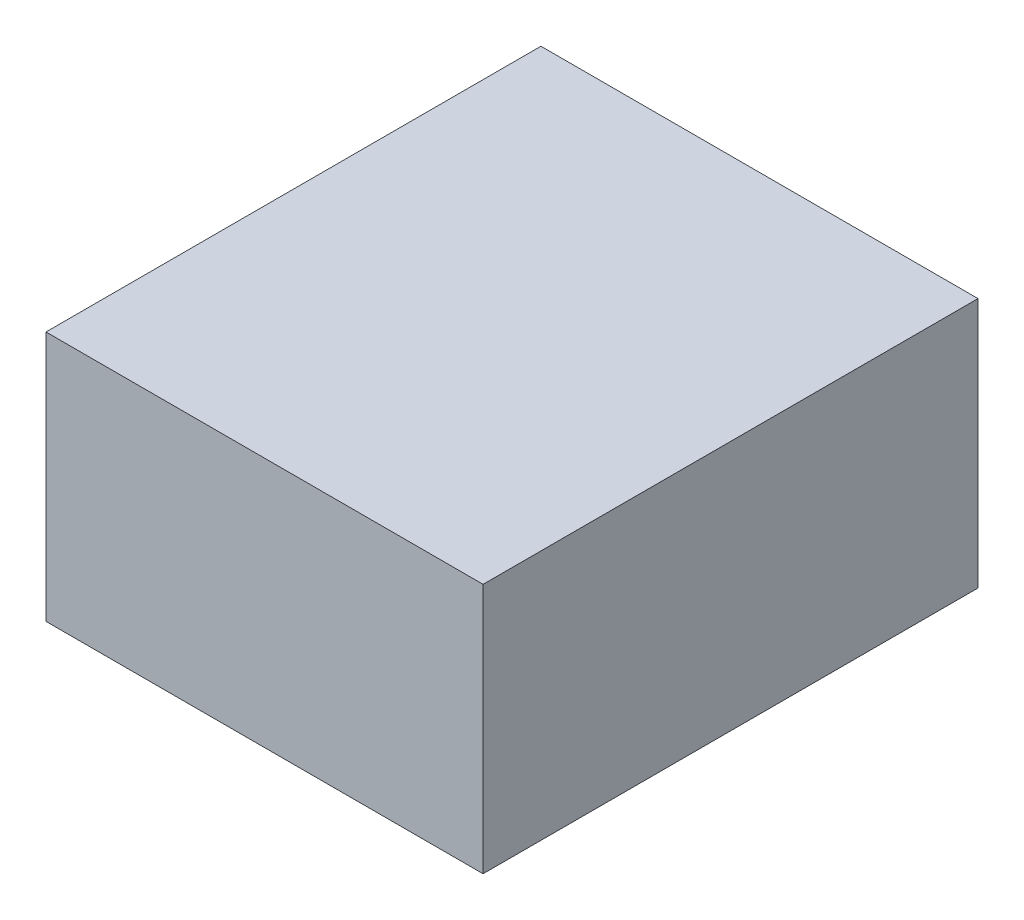
ISO-10303-21;
HEADER;
FILE_DESCRIPTION(('STEP AP214'),'2;1');
FILE_NAME('part.step','',(''),(''),'','','');
FILE_SCHEMA(('AUTOMOTIVE_DESIGN { 1 0 10303 214 1 1 1 1 }'));
ENDSEC;
DATA;
#1=APPLICATION_CONTEXT('core data for automotive mechanical design processes');
#2=APPLICATION_PROTOCOL_DEFINITION('international standard','automotive_design',2000,#1);
#3=PRODUCT_CONTEXT('',#1,'mechanical');
#4=PRODUCT('Part','Part','',(#3));
#5=PRODUCT_RELATED_PRODUCT_CATEGORY('part','',(#4));
#6=PRODUCT_DEFINITION_FORMATION('','',#4);
#7=PRODUCT_DEFINITION_CONTEXT('part definition',#1,'design');
#8=PRODUCT_DEFINITION('design','',#6,#7);
#9=PRODUCT_DEFINITION_SHAPE('','',#8);
#10=(LENGTH_UNIT() NAMED_UNIT(*) SI_UNIT(.MILLI.,.METRE.));
#11=(NAMED_UNIT(*) PLANE_ANGLE_UNIT() SI_UNIT($,.RADIAN.));
#12=(NAMED_UNIT(*) SI_UNIT($,.STERADIAN.) SOLID_ANGLE_UNIT());
#13=UNCERTAINTY_MEASURE_WITH_UNIT(LENGTH_MEASURE(1.E-05),#10,'distance_accuracy_value','');
#14=(GEOMETRIC_REPRESENTATION_CONTEXT(3) GLOBAL_UNCERTAINTY_ASSIGNED_CONTEXT((#13)) GLOBAL_UNIT_ASSIGNED_CONTEXT((#10,
#11,#12)) REPRESENTATION_CONTEXT('',''));
#15=CARTESIAN_POINT('',(0.,0.,0.));
#16=DIRECTION('',(0.,0.,1.));
#17=DIRECTION('',(1.,0.,0.));
#18=AXIS2_PLACEMENT_3D('',#15,#16,#17);
#19=CARTESIAN_POINT('',(34.,-19.5,38.5));
#20=DIRECTION('',(-1.,0.,0.));
#21=DIRECTION('',(0.,0.,1.));
#22=AXIS2_PLACEMENT_3D('',#19,#20,#21);
#23=PLANE('',#22);
#24=DIRECTION('',(0.,1.,0.));
#25=VECTOR('',#24,1.);
#26=CARTESIAN_POINT('',(34.,-19.5,-38.5));
#27=LINE('',#26,#25);
#28=CARTESIAN_POINT('',(34.,-19.5,-38.5));
#29=VERTEX_POINT('',#28);
#30=CARTESIAN_POINT('',(34.,19.5,-38.5));
#31=VERTEX_POINT('',#30);
#32=EDGE_CURVE('E111',#29,#31,#27,.T.);
#33=ORIENTED_EDGE('',*,*,#32,.T.);
#34=DIRECTION('',(0.,0.,-1.));
#35=VECTOR('',#34,1.);
#36=CARTESIAN_POINT('',(34.,19.5,38.5));
#37=LINE('',#36,#35);
#38=CARTESIAN_POINT('',(34.,19.5,38.5));
#39=VERTEX_POINT('',#38);
#40=EDGE_CURVE('E11',#39,#31,#37,.T.);
#41=ORIENTED_EDGE('',*,*,#40,.F.);
#42=DIRECTION('',(0.,1.,0.));
#43=VECTOR('',#42,1.);
#44=CARTESIAN_POINT('',(34.,-19.5,38.5));
#45=LINE('',#44,#43);
#46=CARTESIAN_POINT('',(34.,-19.5,38.5));
#47=VERTEX_POINT('',#46);
#48=EDGE_CURVE('E95',#47,#39,#45,.T.);
#49=ORIENTED_EDGE('',*,*,#48,.F.);
#50=DIRECTION('',(0.,0.,-1.));
#51=VECTOR('',#50,1.);
#52=CARTESIAN_POINT('',(34.,-19.5,38.5));
#53=LINE('',#52,#51);
#54=EDGE_CURVE('E107',#47,#29,#53,.T.);
#55=ORIENTED_EDGE('',*,*,#54,.T.);
#56=EDGE_LOOP('',(#33,#41,#49,#55));
#57=FACE_BOUND('',#56,.T.);
#58=ADVANCED_FACE('F43',(#57),#23,.F.);
#59=CARTESIAN_POINT('',(-34.,19.5,38.5));
#60=DIRECTION('',(0.,-1.,0.));
#61=DIRECTION('',(0.,0.,-1.));
#62=AXIS2_PLACEMENT_3D('',#59,#60,#61);
#63=PLANE('',#62);
#64=DIRECTION('',(-1.,0.,0.));
#65=VECTOR('',#64,1.);
#66=CARTESIAN_POINT('',(-34.,19.5,-38.5));
#67=LINE('',#66,#65);
#68=CARTESIAN_POINT('',(-34.,19.5,-38.5));
#69=VERTEX_POINT('',#68);
#70=EDGE_CURVE('E100',#31,#69,#67,.T.);
#71=ORIENTED_EDGE('',*,*,#70,.T.);
#72=DIRECTION('',(0.,0.,-1.));
#73=VECTOR('',#72,1.);
#74=CARTESIAN_POINT('',(-34.,19.5,38.5));
#75=LINE('',#74,#73);
#76=CARTESIAN_POINT('',(-34.,19.5,38.5));
#77=VERTEX_POINT('',#76);
#78=EDGE_CURVE('E52',#77,#69,#75,.T.);
#79=ORIENTED_EDGE('',*,*,#78,.F.);
#80=DIRECTION('',(-1.,0.,0.));
#81=VECTOR('',#80,1.);
#82=CARTESIAN_POINT('',(-34.,19.5,38.5));
#83=LINE('',#82,#81);
#84=EDGE_CURVE('E90',#39,#77,#83,.T.);
#85=ORIENTED_EDGE('',*,*,#84,.F.);
#86=ORIENTED_EDGE('',*,*,#40,.T.);
#87=EDGE_LOOP('',(#71,#79,#85,#86));
#88=FACE_BOUND('',#87,.T.);
#89=ADVANCED_FACE('F99',(#88),#63,.F.);
#90=CARTESIAN_POINT('',(-34.,-19.5,38.5));
#91=DIRECTION('',(1.,0.,0.));
#92=DIRECTION('',(0.,0.,-1.));
#93=AXIS2_PLACEMENT_3D('',#90,#91,#92);
#94=PLANE('',#93);
#95=DIRECTION('',(0.,-1.,0.));
#96=VECTOR('',#95,1.);
#97=CARTESIAN_POINT('',(-34.,-19.5,-38.5));
#98=LINE('',#97,#96);
#99=CARTESIAN_POINT('',(-34.,-19.5,-38.5));
#100=VERTEX_POINT('',#99);
#101=EDGE_CURVE('E77',#69,#100,#98,.T.);
#102=ORIENTED_EDGE('',*,*,#101,.T.);
#103=DIRECTION('',(0.,0.,-1.));
#104=VECTOR('',#103,1.);
#105=CARTESIAN_POINT('',(-34.,-19.5,38.5));
#106=LINE('',#105,#104);
#107=CARTESIAN_POINT('',(-34.,-19.5,38.5));
#108=VERTEX_POINT('',#107);
#109=EDGE_CURVE('E102',#108,#100,#106,.T.);
#110=ORIENTED_EDGE('',*,*,#109,.F.);
#111=DIRECTION('',(0.,-1.,0.));
#112=VECTOR('',#111,1.);
#113=CARTESIAN_POINT('',(-34.,-19.5,38.5));
#114=LINE('',#113,#112);
#115=EDGE_CURVE('E93',#77,#108,#114,.T.);
#116=ORIENTED_EDGE('',*,*,#115,.F.);
#117=ORIENTED_EDGE('',*,*,#78,.T.);
#118=EDGE_LOOP('',(#102,#110,#116,#117));
#119=FACE_BOUND('',#118,.T.);
#120=ADVANCED_FACE('F103',(#119),#94,.F.);
#121=CARTESIAN_POINT('',(-34.,-19.5,38.5));
#122=DIRECTION('',(0.,1.,0.));
#123=DIRECTION('',(0.,0.,1.));
#124=AXIS2_PLACEMENT_3D('',#121,#122,#123);
#125=PLANE('',#124);
#126=DIRECTION('',(1.,0.,0.));
#127=VECTOR('',#126,1.);
#128=CARTESIAN_POINT('',(-34.,-19.5,-38.5));
#129=LINE('',#128,#127);
#130=EDGE_CURVE('E83',#100,#29,#129,.T.);
#131=ORIENTED_EDGE('',*,*,#130,.T.);
#132=ORIENTED_EDGE('',*,*,#54,.F.);
#133=DIRECTION('',(1.,0.,0.));
#134=VECTOR('',#133,1.);
#135=CARTESIAN_POINT('',(-34.,-19.5,38.5));
#136=LINE('',#135,#134);
#137=EDGE_CURVE('E60',#108,#47,#136,.T.);
#138=ORIENTED_EDGE('',*,*,#137,.F.);
#139=ORIENTED_EDGE('',*,*,#109,.T.);
#140=EDGE_LOOP('',(#131,#132,#138,#139));
#141=FACE_BOUND('',#140,.T.);
#142=ADVANCED_FACE('F124',(#141),#125,.F.);
#143=CARTESIAN_POINT('',(0.,0.,38.5));
#144=DIRECTION('',(0.,0.,-1.));
#145=DIRECTION('',(-1.,0.,0.));
#146=AXIS2_PLACEMENT_3D('',#143,#144,#145);
#147=PLANE('',#146);
#148=ORIENTED_EDGE('',*,*,#48,.T.);
#149=ORIENTED_EDGE('',*,*,#84,.T.);
#150=ORIENTED_EDGE('',*,*,#115,.T.);
#151=ORIENTED_EDGE('',*,*,#137,.T.);
#152=EDGE_LOOP('',(#148,#149,#150,#151));
#153=FACE_BOUND('',#152,.T.);
#154=ADVANCED_FACE('F91',(#153),#147,.F.);
#155=CARTESIAN_POINT('',(0.,0.,-38.5));
#156=DIRECTION('',(0.,0.,-1.));
#157=DIRECTION('',(-1.,0.,0.));
#158=AXIS2_PLACEMENT_3D('',#155,#156,#157);
#159=PLANE('',#158);
#160=ORIENTED_EDGE('',*,*,#32,.F.);
#161=ORIENTED_EDGE('',*,*,#130,.F.);
#162=ORIENTED_EDGE('',*,*,#101,.F.);
#163=ORIENTED_EDGE('',*,*,#70,.F.);
#164=EDGE_LOOP('',(#160,#161,#162,#163));
#165=FACE_BOUND('',#164,.T.);
#166=ADVANCED_FACE('F127',(#165),#159,.T.);
#167=CLOSED_SHELL('',(#58,#89,#120,#142,#154,#166));
#168=MANIFOLD_SOLID_BREP('B2',#167);
#169=ADVANCED_BREP_SHAPE_REPRESENTATION('',(#18,#168),#14);
#170=SHAPE_DEFINITION_REPRESENTATION(#9,#169);
ENDSEC;
END-ISO-10303-21;
